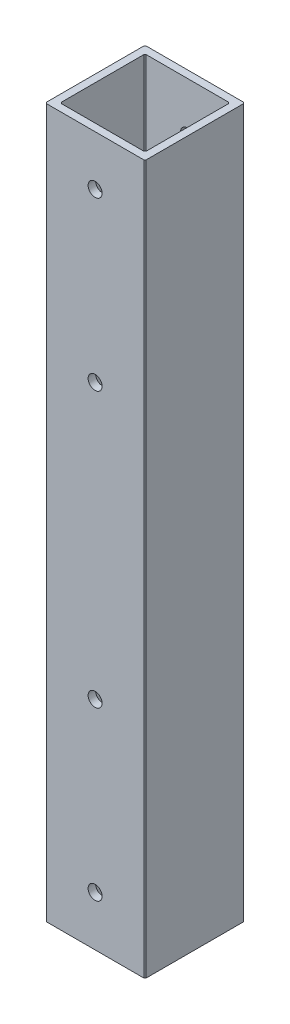
ISO-10303-21;
HEADER;
FILE_DESCRIPTION(('STEP AP214'),'2;1');
FILE_NAME('part.step','',(''),(''),'','','');
FILE_SCHEMA(('AUTOMOTIVE_DESIGN { 1 0 10303 214 1 1 1 1 }'));
ENDSEC;
DATA;
#1=APPLICATION_CONTEXT('core data for automotive mechanical design processes');
#2=APPLICATION_PROTOCOL_DEFINITION('international standard','automotive_design',2000,#1);
#3=PRODUCT_CONTEXT('',#1,'mechanical');
#4=PRODUCT('Part','Part','',(#3));
#5=PRODUCT_RELATED_PRODUCT_CATEGORY('part','',(#4));
#6=PRODUCT_DEFINITION_FORMATION('','',#4);
#7=PRODUCT_DEFINITION_CONTEXT('part definition',#1,'design');
#8=PRODUCT_DEFINITION('design','',#6,#7);
#9=PRODUCT_DEFINITION_SHAPE('','',#8);
#10=(LENGTH_UNIT() NAMED_UNIT(*) SI_UNIT(.MILLI.,.METRE.));
#11=(NAMED_UNIT(*) PLANE_ANGLE_UNIT() SI_UNIT($,.RADIAN.));
#12=(NAMED_UNIT(*) SI_UNIT($,.STERADIAN.) SOLID_ANGLE_UNIT());
#13=UNCERTAINTY_MEASURE_WITH_UNIT(LENGTH_MEASURE(1.E-05),#10,'distance_accuracy_value','');
#14=(GEOMETRIC_REPRESENTATION_CONTEXT(3) GLOBAL_UNCERTAINTY_ASSIGNED_CONTEXT((#13)) GLOBAL_UNIT_ASSIGNED_CONTEXT((#10,
#11,#12)) REPRESENTATION_CONTEXT('',''));
#15=CARTESIAN_POINT('',(0.,0.,0.));
#16=DIRECTION('',(0.,0.,1.));
#17=DIRECTION('',(1.,0.,0.));
#18=AXIS2_PLACEMENT_3D('',#15,#16,#17);
#19=CARTESIAN_POINT('',(-120.,142.,140.));
#20=DIRECTION('',(-1.,0.,0.));
#21=DIRECTION('',(0.,-1.,0.));
#22=AXIS2_PLACEMENT_3D('',#19,#20,#21);
#23=PLANE('',#22);
#24=DIRECTION('',(0.,0.,1.));
#25=VECTOR('',#24,1.);
#26=CARTESIAN_POINT('',(-120.,142.,140.));
#27=LINE('',#26,#25);
#28=CARTESIAN_POINT('',(-120.,142.,140.5));
#29=VERTEX_POINT('',#28);
#30=CARTESIAN_POINT('',(-120.,142.,179.5));
#31=VERTEX_POINT('',#30);
#32=EDGE_CURVE('E195',#29,#31,#27,.T.);
#33=ORIENTED_EDGE('',*,*,#32,.F.);
#34=DIRECTION('',(0.,-1.,0.));
#35=VECTOR('',#34,1.);
#36=CARTESIAN_POINT('',(-120.,-142.,140.5));
#37=LINE('',#36,#35);
#38=CARTESIAN_POINT('',(-120.,-142.,140.5));
#39=VERTEX_POINT('',#38);
#40=EDGE_CURVE('E221',#29,#39,#37,.T.);
#41=ORIENTED_EDGE('',*,*,#40,.T.);
#42=DIRECTION('',(0.,0.,1.));
#43=VECTOR('',#42,1.);
#44=CARTESIAN_POINT('',(-120.,-142.,140.));
#45=LINE('',#44,#43);
#46=CARTESIAN_POINT('',(-120.,-142.,179.5));
#47=VERTEX_POINT('',#46);
#48=EDGE_CURVE('E184',#39,#47,#45,.T.);
#49=ORIENTED_EDGE('',*,*,#48,.T.);
#50=DIRECTION('',(0.,1.,0.));
#51=VECTOR('',#50,1.);
#52=CARTESIAN_POINT('',(-120.,142.,179.5));
#53=LINE('',#52,#51);
#54=EDGE_CURVE('E172',#47,#31,#53,.T.);
#55=ORIENTED_EDGE('',*,*,#54,.T.);
#56=EDGE_LOOP('',(#33,#41,#49,#55));
#57=FACE_BOUND('',#56,.T.);
#58=ADVANCED_FACE('F45',(#57),#23,.T.);
#59=CARTESIAN_POINT('',(-79.9999999999999,142.,140.));
#60=DIRECTION('',(0.,1.,0.));
#61=DIRECTION('',(0.,0.,1.));
#62=AXIS2_PLACEMENT_3D('',#59,#60,#61);
#63=PLANE('',#62);
#64=DIRECTION('',(0.,0.,-1.));
#65=VECTOR('',#64,1.);
#66=CARTESIAN_POINT('',(-117.,142.,177.));
#67=LINE('',#66,#65);
#68=CARTESIAN_POINT('',(-117.,142.,176.5));
#69=VERTEX_POINT('',#68);
#70=CARTESIAN_POINT('',(-117.,142.,143.5));
#71=VERTEX_POINT('',#70);
#72=EDGE_CURVE('E304',#69,#71,#67,.T.);
#73=ORIENTED_EDGE('',*,*,#72,.T.);
#74=DIRECTION('',(-0.707106781186548,0.,0.707106781186548));
#75=VECTOR('',#74,1.);
#76=CARTESIAN_POINT('',(-116.5,142.,143.));
#77=LINE('',#76,#75);
#78=CARTESIAN_POINT('',(-116.5,142.,143.));
#79=VERTEX_POINT('',#78);
#80=EDGE_CURVE('E11',#71,#79,#77,.F.);
#81=ORIENTED_EDGE('',*,*,#80,.T.);
#82=DIRECTION('',(1.,0.,0.));
#83=VECTOR('',#82,1.);
#84=CARTESIAN_POINT('',(-117.,142.,143.));
#85=LINE('',#84,#83);
#86=CARTESIAN_POINT('',(-83.5,142.,143.));
#87=VERTEX_POINT('',#86);
#88=EDGE_CURVE('E294',#79,#87,#85,.T.);
#89=ORIENTED_EDGE('',*,*,#88,.T.);
#90=DIRECTION('',(-0.707106781186548,0.,-0.707106781186548));
#91=VECTOR('',#90,1.);
#92=CARTESIAN_POINT('',(-83.,142.,143.5));
#93=LINE('',#92,#91);
#94=CARTESIAN_POINT('',(-83.,142.,143.5));
#95=VERTEX_POINT('',#94);
#96=EDGE_CURVE('E269',#87,#95,#93,.F.);
#97=ORIENTED_EDGE('',*,*,#96,.T.);
#98=DIRECTION('',(0.,0.,1.));
#99=VECTOR('',#98,1.);
#100=CARTESIAN_POINT('',(-83.,142.,143.));
#101=LINE('',#100,#99);
#102=CARTESIAN_POINT('',(-83.,142.,176.5));
#103=VERTEX_POINT('',#102);
#104=EDGE_CURVE('E309',#95,#103,#101,.T.);
#105=ORIENTED_EDGE('',*,*,#104,.T.);
#106=DIRECTION('',(0.707106781186548,0.,-0.707106781186548));
#107=VECTOR('',#106,1.);
#108=CARTESIAN_POINT('',(-83.4999999999999,142.,177.));
#109=LINE('',#108,#107);
#110=CARTESIAN_POINT('',(-83.4999999999999,142.,177.));
#111=VERTEX_POINT('',#110);
#112=EDGE_CURVE('E275',#103,#111,#109,.F.);
#113=ORIENTED_EDGE('',*,*,#112,.T.);
#114=DIRECTION('',(-1.,0.,0.));
#115=VECTOR('',#114,1.);
#116=CARTESIAN_POINT('',(-83.,142.,177.));
#117=LINE('',#116,#115);
#118=CARTESIAN_POINT('',(-116.5,142.,177.));
#119=VERTEX_POINT('',#118);
#120=EDGE_CURVE('E313',#111,#119,#117,.T.);
#121=ORIENTED_EDGE('',*,*,#120,.T.);
#122=DIRECTION('',(0.707106781186548,0.,0.707106781186548));
#123=VECTOR('',#122,1.);
#124=CARTESIAN_POINT('',(-117.,142.,176.5));
#125=LINE('',#124,#123);
#126=EDGE_CURVE('E263',#119,#69,#125,.F.);
#127=ORIENTED_EDGE('',*,*,#126,.T.);
#128=EDGE_LOOP('',(#73,#81,#89,#97,#105,#113,#121,#127));
#129=FACE_BOUND('',#128,.T.);
#130=DIRECTION('',(0.,0.,1.));
#131=VECTOR('',#130,1.);
#132=CARTESIAN_POINT('',(-79.9999999999999,142.,140.));
#133=LINE('',#132,#131);
#134=CARTESIAN_POINT('',(-79.9999999999999,142.,140.5));
#135=VERTEX_POINT('',#134);
#136=CARTESIAN_POINT('',(-79.9999999999999,142.,179.5));
#137=VERTEX_POINT('',#136);
#138=EDGE_CURVE('E183',#135,#137,#133,.T.);
#139=ORIENTED_EDGE('',*,*,#138,.F.);
#140=DIRECTION('',(-0.707106781186543,0.,-0.707106781186553));
#141=VECTOR('',#140,1.);
#142=CARTESIAN_POINT('',(-80.2499999999999,142.,140.25));
#143=LINE('',#142,#141);
#144=CARTESIAN_POINT('',(-80.4999999999999,142.,140.));
#145=VERTEX_POINT('',#144);
#146=EDGE_CURVE('E187',#135,#145,#143,.T.);
#147=ORIENTED_EDGE('',*,*,#146,.T.);
#148=DIRECTION('',(-1.,0.,0.));
#149=VECTOR('',#148,1.);
#150=CARTESIAN_POINT('',(-79.9999999999999,142.,140.));
#151=LINE('',#150,#149);
#152=CARTESIAN_POINT('',(-119.5,142.,140.));
#153=VERTEX_POINT('',#152);
#154=EDGE_CURVE('E336',#145,#153,#151,.T.);
#155=ORIENTED_EDGE('',*,*,#154,.T.);
#156=DIRECTION('',(-0.707106781186543,0.,0.707106781186553));
#157=VECTOR('',#156,1.);
#158=CARTESIAN_POINT('',(-99.7500000000002,142.,120.25));
#159=LINE('',#158,#157);
#160=EDGE_CURVE('E201',#153,#29,#159,.T.);
#161=ORIENTED_EDGE('',*,*,#160,.T.);
#162=ORIENTED_EDGE('',*,*,#32,.T.);
#163=DIRECTION('',(-0.707106781186543,0.,-0.707106781186552));
#164=VECTOR('',#163,1.);
#165=CARTESIAN_POINT('',(-119.75,142.,179.75));
#166=LINE('',#165,#164);
#167=CARTESIAN_POINT('',(-119.5,142.,180.));
#168=VERTEX_POINT('',#167);
#169=EDGE_CURVE('E193',#31,#168,#166,.F.);
#170=ORIENTED_EDGE('',*,*,#169,.T.);
#171=DIRECTION('',(-1.,0.,0.));
#172=VECTOR('',#171,1.);
#173=CARTESIAN_POINT('',(-79.9999999999999,142.,180.));
#174=LINE('',#173,#172);
#175=CARTESIAN_POINT('',(-80.4999999999998,142.,180.));
#176=VERTEX_POINT('',#175);
#177=EDGE_CURVE('E337',#176,#168,#174,.T.);
#178=ORIENTED_EDGE('',*,*,#177,.F.);
#179=DIRECTION('',(-0.707106781186543,0.,0.707106781186552));
#180=VECTOR('',#179,1.);
#181=CARTESIAN_POINT('',(-60.2499999999999,142.,159.75));
#182=LINE('',#181,#180);
#183=EDGE_CURVE('E189',#176,#137,#182,.F.);
#184=ORIENTED_EDGE('',*,*,#183,.T.);
#185=EDGE_LOOP('',(#139,#147,#155,#161,#162,#170,#178,#184));
#186=FACE_BOUND('',#185,.T.);
#187=ADVANCED_FACE('F301',(#129,#186),#63,.T.);
#188=CARTESIAN_POINT('',(-80.,-142.,140.));
#189=DIRECTION('',(1.,0.,0.));
#190=DIRECTION('',(0.,1.,0.));
#191=AXIS2_PLACEMENT_3D('',#188,#189,#190);
#192=PLANE('',#191);
#193=DIRECTION('',(0.,0.,1.));
#194=VECTOR('',#193,1.);
#195=CARTESIAN_POINT('',(-80.,-142.,140.));
#196=LINE('',#195,#194);
#197=CARTESIAN_POINT('',(-80.,-142.,140.5));
#198=VERTEX_POINT('',#197);
#199=CARTESIAN_POINT('',(-80.,-142.,179.5));
#200=VERTEX_POINT('',#199);
#201=EDGE_CURVE('E164',#198,#200,#196,.T.);
#202=ORIENTED_EDGE('',*,*,#201,.F.);
#203=DIRECTION('',(0.,1.,0.));
#204=VECTOR('',#203,1.);
#205=CARTESIAN_POINT('',(-79.9999999999999,142.,140.5));
#206=LINE('',#205,#204);
#207=EDGE_CURVE('E178',#198,#135,#206,.T.);
#208=ORIENTED_EDGE('',*,*,#207,.T.);
#209=ORIENTED_EDGE('',*,*,#138,.T.);
#210=DIRECTION('',(0.,-1.,0.));
#211=VECTOR('',#210,1.);
#212=CARTESIAN_POINT('',(-80.,-142.,179.5));
#213=LINE('',#212,#211);
#214=EDGE_CURVE('E181',#137,#200,#213,.T.);
#215=ORIENTED_EDGE('',*,*,#214,.T.);
#216=EDGE_LOOP('',(#202,#208,#209,#215));
#217=FACE_BOUND('',#216,.T.);
#218=ADVANCED_FACE('F176',(#217),#192,.T.);
#219=CARTESIAN_POINT('',(-120.,-142.,140.));
#220=DIRECTION('',(0.,-1.,0.));
#221=DIRECTION('',(0.,0.,-1.));
#222=AXIS2_PLACEMENT_3D('',#219,#220,#221);
#223=PLANE('',#222);
#224=DIRECTION('',(1.,0.,0.));
#225=VECTOR('',#224,1.);
#226=CARTESIAN_POINT('',(-117.,-142.,143.));
#227=LINE('',#226,#225);
#228=CARTESIAN_POINT('',(-116.5,-142.,143.));
#229=VERTEX_POINT('',#228);
#230=CARTESIAN_POINT('',(-83.5,-142.,143.));
#231=VERTEX_POINT('',#230);
#232=EDGE_CURVE('E284',#229,#231,#227,.T.);
#233=ORIENTED_EDGE('',*,*,#232,.F.);
#234=DIRECTION('',(0.707106781186548,0.,-0.707106781186548));
#235=VECTOR('',#234,1.);
#236=CARTESIAN_POINT('',(-116.5,-142.,143.));
#237=LINE('',#236,#235);
#238=CARTESIAN_POINT('',(-117.,-142.,143.5));
#239=VERTEX_POINT('',#238);
#240=EDGE_CURVE('E55',#229,#239,#237,.F.);
#241=ORIENTED_EDGE('',*,*,#240,.T.);
#242=DIRECTION('',(0.,0.,-1.));
#243=VECTOR('',#242,1.);
#244=CARTESIAN_POINT('',(-117.,-142.,177.));
#245=LINE('',#244,#243);
#246=CARTESIAN_POINT('',(-117.,-142.,176.5));
#247=VERTEX_POINT('',#246);
#248=EDGE_CURVE('E282',#247,#239,#245,.T.);
#249=ORIENTED_EDGE('',*,*,#248,.F.);
#250=DIRECTION('',(-0.707106781186548,0.,-0.707106781186548));
#251=VECTOR('',#250,1.);
#252=CARTESIAN_POINT('',(-117.,-142.,176.5));
#253=LINE('',#252,#251);
#254=CARTESIAN_POINT('',(-116.5,-142.,177.));
#255=VERTEX_POINT('',#254);
#256=EDGE_CURVE('E260',#247,#255,#253,.F.);
#257=ORIENTED_EDGE('',*,*,#256,.T.);
#258=DIRECTION('',(-1.,0.,0.));
#259=VECTOR('',#258,1.);
#260=CARTESIAN_POINT('',(-83.,-142.,177.));
#261=LINE('',#260,#259);
#262=CARTESIAN_POINT('',(-83.4999999999999,-142.,177.));
#263=VERTEX_POINT('',#262);
#264=EDGE_CURVE('E295',#263,#255,#261,.T.);
#265=ORIENTED_EDGE('',*,*,#264,.F.);
#266=DIRECTION('',(-0.707106781186548,0.,0.707106781186548));
#267=VECTOR('',#266,1.);
#268=CARTESIAN_POINT('',(-83.4999999999999,-142.,177.));
#269=LINE('',#268,#267);
#270=CARTESIAN_POINT('',(-83.,-142.,176.5));
#271=VERTEX_POINT('',#270);
#272=EDGE_CURVE('E272',#263,#271,#269,.F.);
#273=ORIENTED_EDGE('',*,*,#272,.T.);
#274=DIRECTION('',(0.,0.,1.));
#275=VECTOR('',#274,1.);
#276=CARTESIAN_POINT('',(-83.,-142.,143.));
#277=LINE('',#276,#275);
#278=CARTESIAN_POINT('',(-83.,-142.,143.5));
#279=VERTEX_POINT('',#278);
#280=EDGE_CURVE('E327',#279,#271,#277,.T.);
#281=ORIENTED_EDGE('',*,*,#280,.F.);
#282=DIRECTION('',(0.707106781186548,0.,0.707106781186548));
#283=VECTOR('',#282,1.);
#284=CARTESIAN_POINT('',(-83.,-142.,143.5));
#285=LINE('',#284,#283);
#286=EDGE_CURVE('E266',#279,#231,#285,.F.);
#287=ORIENTED_EDGE('',*,*,#286,.T.);
#288=EDGE_LOOP('',(#233,#241,#249,#257,#265,#273,#281,#287));
#289=FACE_BOUND('',#288,.T.);
#290=DIRECTION('',(1.,0.,0.));
#291=VECTOR('',#290,1.);
#292=CARTESIAN_POINT('',(-120.,-142.,140.));
#293=LINE('',#292,#291);
#294=CARTESIAN_POINT('',(-119.5,-142.,140.));
#295=VERTEX_POINT('',#294);
#296=CARTESIAN_POINT('',(-80.5,-142.,140.));
#297=VERTEX_POINT('',#296);
#298=EDGE_CURVE('E167',#295,#297,#293,.T.);
#299=ORIENTED_EDGE('',*,*,#298,.T.);
#300=DIRECTION('',(0.707106781186543,0.,0.707106781186553));
#301=VECTOR('',#300,1.);
#302=CARTESIAN_POINT('',(-100.25,-142.,120.25));
#303=LINE('',#302,#301);
#304=EDGE_CURVE('E161',#297,#198,#303,.T.);
#305=ORIENTED_EDGE('',*,*,#304,.T.);
#306=ORIENTED_EDGE('',*,*,#201,.T.);
#307=DIRECTION('',(0.707106781186543,0.,-0.707106781186552));
#308=VECTOR('',#307,1.);
#309=CARTESIAN_POINT('',(-80.2499999999997,-142.,179.75));
#310=LINE('',#309,#308);
#311=CARTESIAN_POINT('',(-80.4999999999999,-142.,180.));
#312=VERTEX_POINT('',#311);
#313=EDGE_CURVE('E212',#200,#312,#310,.F.);
#314=ORIENTED_EDGE('',*,*,#313,.T.);
#315=DIRECTION('',(1.,0.,0.));
#316=VECTOR('',#315,1.);
#317=CARTESIAN_POINT('',(-120.,-142.,180.));
#318=LINE('',#317,#316);
#319=CARTESIAN_POINT('',(-119.5,-142.,180.));
#320=VERTEX_POINT('',#319);
#321=EDGE_CURVE('E324',#320,#312,#318,.T.);
#322=ORIENTED_EDGE('',*,*,#321,.F.);
#323=DIRECTION('',(0.707106781186543,0.,0.707106781186552));
#324=VECTOR('',#323,1.);
#325=CARTESIAN_POINT('',(-139.75,-142.,159.75));
#326=LINE('',#325,#324);
#327=EDGE_CURVE('E62',#320,#47,#326,.F.);
#328=ORIENTED_EDGE('',*,*,#327,.T.);
#329=ORIENTED_EDGE('',*,*,#48,.F.);
#330=DIRECTION('',(0.707106781186543,0.,-0.707106781186553));
#331=VECTOR('',#330,1.);
#332=CARTESIAN_POINT('',(-119.75,-142.,140.25));
#333=LINE('',#332,#331);
#334=EDGE_CURVE('E70',#39,#295,#333,.T.);
#335=ORIENTED_EDGE('',*,*,#334,.T.);
#336=EDGE_LOOP('',(#299,#305,#306,#314,#322,#328,#329,#335));
#337=FACE_BOUND('',#336,.T.);
#338=ADVANCED_FACE('F163',(#289,#337),#223,.T.);
#339=CARTESIAN_POINT('',(0.,0.,140.));
#340=DIRECTION('',(0.,0.,1.));
#341=DIRECTION('',(1.,0.,0.));
#342=AXIS2_PLACEMENT_3D('',#339,#340,#341);
#343=PLANE('',#342);
#344=CARTESIAN_POINT('',(-100.,122.,140.));
#345=DIRECTION('',(0.,0.,-1.));
#346=DIRECTION('',(-1.,0.,0.));
#347=AXIS2_PLACEMENT_3D('',#344,#345,#346);
#348=CIRCLE('',#347,2.79999999999998);
#349=CARTESIAN_POINT('',(-102.8,122.,140.));
#350=VERTEX_POINT('',#349);
#351=EDGE_CURVE('E726',#350,#350,#348,.T.);
#352=ORIENTED_EDGE('',*,*,#351,.F.);
#353=EDGE_LOOP('',(#352));
#354=FACE_BOUND('',#353,.T.);
#355=CARTESIAN_POINT('',(-100.,55.,140.));
#356=DIRECTION('',(0.,0.,-1.));
#357=DIRECTION('',(-1.,0.,0.));
#358=AXIS2_PLACEMENT_3D('',#355,#356,#357);
#359=CIRCLE('',#358,2.79999999999998);
#360=CARTESIAN_POINT('',(-102.8,55.,140.));
#361=VERTEX_POINT('',#360);
#362=EDGE_CURVE('E707',#361,#361,#359,.T.);
#363=ORIENTED_EDGE('',*,*,#362,.F.);
#364=EDGE_LOOP('',(#363));
#365=FACE_BOUND('',#364,.T.);
#366=CARTESIAN_POINT('',(-100.,-55.,140.));
#367=DIRECTION('',(0.,0.,-1.));
#368=DIRECTION('',(-1.,0.,0.));
#369=AXIS2_PLACEMENT_3D('',#366,#367,#368);
#370=CIRCLE('',#369,2.79999999999998);
#371=CARTESIAN_POINT('',(-102.8,-55.,140.));
#372=VERTEX_POINT('',#371);
#373=EDGE_CURVE('E697',#372,#372,#370,.T.);
#374=ORIENTED_EDGE('',*,*,#373,.F.);
#375=EDGE_LOOP('',(#374));
#376=FACE_BOUND('',#375,.T.);
#377=CARTESIAN_POINT('',(-100.,-122.,140.));
#378=DIRECTION('',(0.,0.,-1.));
#379=DIRECTION('',(-1.,0.,0.));
#380=AXIS2_PLACEMENT_3D('',#377,#378,#379);
#381=CIRCLE('',#380,2.79999999999998);
#382=CARTESIAN_POINT('',(-102.8,-122.,140.));
#383=VERTEX_POINT('',#382);
#384=EDGE_CURVE('E704',#383,#383,#381,.T.);
#385=ORIENTED_EDGE('',*,*,#384,.F.);
#386=EDGE_LOOP('',(#385));
#387=FACE_BOUND('',#386,.T.);
#388=ORIENTED_EDGE('',*,*,#154,.F.);
#389=DIRECTION('',(0.,-1.,0.));
#390=VECTOR('',#389,1.);
#391=CARTESIAN_POINT('',(-80.5,-142.,140.));
#392=LINE('',#391,#390);
#393=EDGE_CURVE('E209',#145,#297,#392,.T.);
#394=ORIENTED_EDGE('',*,*,#393,.T.);
#395=ORIENTED_EDGE('',*,*,#298,.F.);
#396=DIRECTION('',(0.,1.,0.));
#397=VECTOR('',#396,1.);
#398=CARTESIAN_POINT('',(-119.5,142.,140.));
#399=LINE('',#398,#397);
#400=EDGE_CURVE('E206',#295,#153,#399,.T.);
#401=ORIENTED_EDGE('',*,*,#400,.T.);
#402=EDGE_LOOP('',(#388,#394,#395,#401));
#403=FACE_BOUND('',#402,.T.);
#404=ADVANCED_FACE('F368',(#354,#365,#376,#387,#403),#343,.F.);
#405=CARTESIAN_POINT('',(0.,0.,180.));
#406=DIRECTION('',(0.,0.,1.));
#407=DIRECTION('',(1.,0.,0.));
#408=AXIS2_PLACEMENT_3D('',#405,#406,#407);
#409=PLANE('',#408);
#410=CARTESIAN_POINT('',(-100.,122.,180.));
#411=DIRECTION('',(0.,0.,-1.));
#412=DIRECTION('',(-1.,0.,0.));
#413=AXIS2_PLACEMENT_3D('',#410,#411,#412);
#414=CIRCLE('',#413,2.79999999999998);
#415=CARTESIAN_POINT('',(-102.8,122.,180.));
#416=VERTEX_POINT('',#415);
#417=EDGE_CURVE('E754',#416,#416,#414,.T.);
#418=ORIENTED_EDGE('',*,*,#417,.T.);
#419=EDGE_LOOP('',(#418));
#420=FACE_BOUND('',#419,.T.);
#421=CARTESIAN_POINT('',(-100.,55.,180.));
#422=DIRECTION('',(0.,0.,-1.));
#423=DIRECTION('',(-1.,0.,0.));
#424=AXIS2_PLACEMENT_3D('',#421,#422,#423);
#425=CIRCLE('',#424,2.79999999999998);
#426=CARTESIAN_POINT('',(-102.8,55.,180.));
#427=VERTEX_POINT('',#426);
#428=EDGE_CURVE('E746',#427,#427,#425,.T.);
#429=ORIENTED_EDGE('',*,*,#428,.T.);
#430=EDGE_LOOP('',(#429));
#431=FACE_BOUND('',#430,.T.);
#432=CARTESIAN_POINT('',(-100.,-55.,180.));
#433=DIRECTION('',(0.,0.,-1.));
#434=DIRECTION('',(-1.,0.,0.));
#435=AXIS2_PLACEMENT_3D('',#432,#433,#434);
#436=CIRCLE('',#435,2.79999999999998);
#437=CARTESIAN_POINT('',(-102.8,-55.,180.));
#438=VERTEX_POINT('',#437);
#439=EDGE_CURVE('E738',#438,#438,#436,.T.);
#440=ORIENTED_EDGE('',*,*,#439,.T.);
#441=EDGE_LOOP('',(#440));
#442=FACE_BOUND('',#441,.T.);
#443=CARTESIAN_POINT('',(-100.,-122.,180.));
#444=DIRECTION('',(0.,0.,-1.));
#445=DIRECTION('',(-1.,0.,0.));
#446=AXIS2_PLACEMENT_3D('',#443,#444,#445);
#447=CIRCLE('',#446,2.79999999999998);
#448=CARTESIAN_POINT('',(-102.8,-122.,180.));
#449=VERTEX_POINT('',#448);
#450=EDGE_CURVE('E730',#449,#449,#447,.T.);
#451=ORIENTED_EDGE('',*,*,#450,.T.);
#452=EDGE_LOOP('',(#451));
#453=FACE_BOUND('',#452,.T.);
#454=ORIENTED_EDGE('',*,*,#177,.T.);
#455=DIRECTION('',(0.,-1.,0.));
#456=VECTOR('',#455,1.);
#457=CARTESIAN_POINT('',(-119.5,0.,180.));
#458=LINE('',#457,#456);
#459=EDGE_CURVE('E228',#168,#320,#458,.T.);
#460=ORIENTED_EDGE('',*,*,#459,.T.);
#461=ORIENTED_EDGE('',*,*,#321,.T.);
#462=DIRECTION('',(0.,1.,0.));
#463=VECTOR('',#462,1.);
#464=CARTESIAN_POINT('',(-80.4999999999999,0.,180.));
#465=LINE('',#464,#463);
#466=EDGE_CURVE('E224',#312,#176,#465,.T.);
#467=ORIENTED_EDGE('',*,*,#466,.T.);
#468=EDGE_LOOP('',(#454,#460,#461,#467));
#469=FACE_BOUND('',#468,.T.);
#470=ADVANCED_FACE('F361',(#420,#431,#442,#453,#469),#409,.T.);
#471=CARTESIAN_POINT('',(-117.,142.,143.));
#472=DIRECTION('',(0.,0.,-1.));
#473=DIRECTION('',(-1.,0.,0.));
#474=AXIS2_PLACEMENT_3D('',#471,#472,#473);
#475=PLANE('',#474);
#476=CARTESIAN_POINT('',(-100.,122.,143.));
#477=DIRECTION('',(0.,0.,-1.));
#478=DIRECTION('',(-1.,0.,0.));
#479=AXIS2_PLACEMENT_3D('',#476,#477,#478);
#480=CIRCLE('',#479,2.79999999999999);
#481=CARTESIAN_POINT('',(-102.8,122.,143.));
#482=VERTEX_POINT('',#481);
#483=EDGE_CURVE('E722',#482,#482,#480,.T.);
#484=ORIENTED_EDGE('',*,*,#483,.T.);
#485=EDGE_LOOP('',(#484));
#486=FACE_BOUND('',#485,.T.);
#487=CARTESIAN_POINT('',(-100.,55.,143.));
#488=DIRECTION('',(0.,0.,-1.));
#489=DIRECTION('',(-1.,0.,0.));
#490=AXIS2_PLACEMENT_3D('',#487,#488,#489);
#491=CIRCLE('',#490,2.79999999999999);
#492=CARTESIAN_POINT('',(-102.8,55.,143.));
#493=VERTEX_POINT('',#492);
#494=EDGE_CURVE('E700',#493,#493,#491,.T.);
#495=ORIENTED_EDGE('',*,*,#494,.T.);
#496=EDGE_LOOP('',(#495));
#497=FACE_BOUND('',#496,.T.);
#498=CARTESIAN_POINT('',(-100.,-55.,143.));
#499=DIRECTION('',(0.,0.,-1.));
#500=DIRECTION('',(-1.,0.,0.));
#501=AXIS2_PLACEMENT_3D('',#498,#499,#500);
#502=CIRCLE('',#501,2.79999999999999);
#503=CARTESIAN_POINT('',(-102.8,-55.,143.));
#504=VERTEX_POINT('',#503);
#505=EDGE_CURVE('E694',#504,#504,#502,.T.);
#506=ORIENTED_EDGE('',*,*,#505,.T.);
#507=EDGE_LOOP('',(#506));
#508=FACE_BOUND('',#507,.T.);
#509=CARTESIAN_POINT('',(-100.,-122.,143.));
#510=DIRECTION('',(0.,0.,-1.));
#511=DIRECTION('',(-1.,0.,0.));
#512=AXIS2_PLACEMENT_3D('',#509,#510,#511);
#513=CIRCLE('',#512,2.79999999999999);
#514=CARTESIAN_POINT('',(-102.8,-122.,143.));
#515=VERTEX_POINT('',#514);
#516=EDGE_CURVE('E316',#515,#515,#513,.T.);
#517=ORIENTED_EDGE('',*,*,#516,.T.);
#518=EDGE_LOOP('',(#517));
#519=FACE_BOUND('',#518,.T.);
#520=ORIENTED_EDGE('',*,*,#232,.T.);
#521=DIRECTION('',(0.,1.,0.));
#522=VECTOR('',#521,1.);
#523=CARTESIAN_POINT('',(-83.5,142.,143.));
#524=LINE('',#523,#522);
#525=EDGE_CURVE('E257',#231,#87,#524,.T.);
#526=ORIENTED_EDGE('',*,*,#525,.T.);
#527=ORIENTED_EDGE('',*,*,#88,.F.);
#528=DIRECTION('',(0.,-1.,0.));
#529=VECTOR('',#528,1.);
#530=CARTESIAN_POINT('',(-116.5,-142.,143.));
#531=LINE('',#530,#529);
#532=EDGE_CURVE('E253',#79,#229,#531,.T.);
#533=ORIENTED_EDGE('',*,*,#532,.T.);
#534=EDGE_LOOP('',(#520,#526,#527,#533));
#535=FACE_BOUND('',#534,.T.);
#536=ADVANCED_FACE('F306',(#486,#497,#508,#519,#535),#475,.F.);
#537=CARTESIAN_POINT('',(-117.,142.,177.));
#538=DIRECTION('',(-1.,0.,0.));
#539=DIRECTION('',(0.,0.,1.));
#540=AXIS2_PLACEMENT_3D('',#537,#538,#539);
#541=PLANE('',#540);
#542=ORIENTED_EDGE('',*,*,#72,.F.);
#543=DIRECTION('',(0.,-1.,0.));
#544=VECTOR('',#543,1.);
#545=CARTESIAN_POINT('',(-117.,-142.,176.5));
#546=LINE('',#545,#544);
#547=EDGE_CURVE('E235',#69,#247,#546,.T.);
#548=ORIENTED_EDGE('',*,*,#547,.T.);
#549=ORIENTED_EDGE('',*,*,#248,.T.);
#550=DIRECTION('',(0.,1.,0.));
#551=VECTOR('',#550,1.);
#552=CARTESIAN_POINT('',(-117.,142.,143.5));
#553=LINE('',#552,#551);
#554=EDGE_CURVE('E232',#239,#71,#553,.T.);
#555=ORIENTED_EDGE('',*,*,#554,.T.);
#556=EDGE_LOOP('',(#542,#548,#549,#555));
#557=FACE_BOUND('',#556,.T.);
#558=ADVANCED_FACE('F290',(#557),#541,.F.);
#559=CARTESIAN_POINT('',(-83.,142.,177.));
#560=DIRECTION('',(0.,0.,1.));
#561=DIRECTION('',(1.,0.,0.));
#562=AXIS2_PLACEMENT_3D('',#559,#560,#561);
#563=PLANE('',#562);
#564=CARTESIAN_POINT('',(-100.,122.,177.));
#565=DIRECTION('',(0.,0.,-1.));
#566=DIRECTION('',(-1.,0.,0.));
#567=AXIS2_PLACEMENT_3D('',#564,#565,#566);
#568=CIRCLE('',#567,2.79999999999998);
#569=CARTESIAN_POINT('',(-102.8,122.,177.));
#570=VERTEX_POINT('',#569);
#571=EDGE_CURVE('E758',#570,#570,#568,.T.);
#572=ORIENTED_EDGE('',*,*,#571,.F.);
#573=EDGE_LOOP('',(#572));
#574=FACE_BOUND('',#573,.T.);
#575=CARTESIAN_POINT('',(-100.,55.,177.));
#576=DIRECTION('',(0.,0.,-1.));
#577=DIRECTION('',(-1.,0.,0.));
#578=AXIS2_PLACEMENT_3D('',#575,#576,#577);
#579=CIRCLE('',#578,2.79999999999998);
#580=CARTESIAN_POINT('',(-102.8,55.,177.));
#581=VERTEX_POINT('',#580);
#582=EDGE_CURVE('E750',#581,#581,#579,.T.);
#583=ORIENTED_EDGE('',*,*,#582,.F.);
#584=EDGE_LOOP('',(#583));
#585=FACE_BOUND('',#584,.T.);
#586=CARTESIAN_POINT('',(-100.,-55.,177.));
#587=DIRECTION('',(0.,0.,-1.));
#588=DIRECTION('',(-1.,0.,0.));
#589=AXIS2_PLACEMENT_3D('',#586,#587,#588);
#590=CIRCLE('',#589,2.79999999999998);
#591=CARTESIAN_POINT('',(-102.8,-55.,177.));
#592=VERTEX_POINT('',#591);
#593=EDGE_CURVE('E742',#592,#592,#590,.T.);
#594=ORIENTED_EDGE('',*,*,#593,.F.);
#595=EDGE_LOOP('',(#594));
#596=FACE_BOUND('',#595,.T.);
#597=CARTESIAN_POINT('',(-100.,-122.,177.));
#598=DIRECTION('',(0.,0.,-1.));
#599=DIRECTION('',(-1.,0.,0.));
#600=AXIS2_PLACEMENT_3D('',#597,#598,#599);
#601=CIRCLE('',#600,2.79999999999998);
#602=CARTESIAN_POINT('',(-102.8,-122.,177.));
#603=VERTEX_POINT('',#602);
#604=EDGE_CURVE('E734',#603,#603,#601,.T.);
#605=ORIENTED_EDGE('',*,*,#604,.F.);
#606=EDGE_LOOP('',(#605));
#607=FACE_BOUND('',#606,.T.);
#608=ORIENTED_EDGE('',*,*,#264,.T.);
#609=DIRECTION('',(0.,1.,0.));
#610=VECTOR('',#609,1.);
#611=CARTESIAN_POINT('',(-116.5,142.,177.));
#612=LINE('',#611,#610);
#613=EDGE_CURVE('E243',#255,#119,#612,.T.);
#614=ORIENTED_EDGE('',*,*,#613,.T.);
#615=ORIENTED_EDGE('',*,*,#120,.F.);
#616=DIRECTION('',(0.,-1.,0.));
#617=VECTOR('',#616,1.);
#618=CARTESIAN_POINT('',(-83.4999999999999,-142.,177.));
#619=LINE('',#618,#617);
#620=EDGE_CURVE('E239',#111,#263,#619,.T.);
#621=ORIENTED_EDGE('',*,*,#620,.T.);
#622=EDGE_LOOP('',(#608,#614,#615,#621));
#623=FACE_BOUND('',#622,.T.);
#624=ADVANCED_FACE('F430',(#574,#585,#596,#607,#623),#563,.F.);
#625=CARTESIAN_POINT('',(-83.,142.,143.));
#626=DIRECTION('',(1.,0.,0.));
#627=DIRECTION('',(0.,0.,-1.));
#628=AXIS2_PLACEMENT_3D('',#625,#626,#627);
#629=PLANE('',#628);
#630=ORIENTED_EDGE('',*,*,#104,.F.);
#631=DIRECTION('',(0.,-1.,0.));
#632=VECTOR('',#631,1.);
#633=CARTESIAN_POINT('',(-83.,-142.,143.5));
#634=LINE('',#633,#632);
#635=EDGE_CURVE('E249',#95,#279,#634,.T.);
#636=ORIENTED_EDGE('',*,*,#635,.T.);
#637=ORIENTED_EDGE('',*,*,#280,.T.);
#638=DIRECTION('',(0.,1.,0.));
#639=VECTOR('',#638,1.);
#640=CARTESIAN_POINT('',(-83.,142.,176.5));
#641=LINE('',#640,#639);
#642=EDGE_CURVE('E246',#271,#103,#641,.T.);
#643=ORIENTED_EDGE('',*,*,#642,.T.);
#644=EDGE_LOOP('',(#630,#636,#637,#643));
#645=FACE_BOUND('',#644,.T.);
#646=ADVANCED_FACE('F436',(#645),#629,.F.);
#647=CARTESIAN_POINT('',(-100.,-122.,140.));
#648=DIRECTION('',(0.,0.,-1.));
#649=DIRECTION('',(-1.,0.,0.));
#650=AXIS2_PLACEMENT_3D('',#647,#648,#649);
#651=CYLINDRICAL_SURFACE('',#650,2.79999999999999);
#652=ORIENTED_EDGE('',*,*,#516,.F.);
#653=EDGE_LOOP('',(#652));
#654=FACE_BOUND('',#653,.T.);
#655=ORIENTED_EDGE('',*,*,#384,.T.);
#656=EDGE_LOOP('',(#655));
#657=FACE_BOUND('',#656,.T.);
#658=ADVANCED_FACE('F439',(#654,#657),#651,.F.);
#659=CARTESIAN_POINT('',(-100.,-55.,140.));
#660=DIRECTION('',(0.,0.,-1.));
#661=DIRECTION('',(-1.,0.,0.));
#662=AXIS2_PLACEMENT_3D('',#659,#660,#661);
#663=CYLINDRICAL_SURFACE('',#662,2.79999999999999);
#664=ORIENTED_EDGE('',*,*,#505,.F.);
#665=EDGE_LOOP('',(#664));
#666=FACE_BOUND('',#665,.T.);
#667=ORIENTED_EDGE('',*,*,#373,.T.);
#668=EDGE_LOOP('',(#667));
#669=FACE_BOUND('',#668,.T.);
#670=ADVANCED_FACE('F445',(#666,#669),#663,.F.);
#671=CARTESIAN_POINT('',(-100.,55.,140.));
#672=DIRECTION('',(0.,0.,-1.));
#673=DIRECTION('',(-1.,0.,0.));
#674=AXIS2_PLACEMENT_3D('',#671,#672,#673);
#675=CYLINDRICAL_SURFACE('',#674,2.79999999999999);
#676=ORIENTED_EDGE('',*,*,#494,.F.);
#677=EDGE_LOOP('',(#676));
#678=FACE_BOUND('',#677,.T.);
#679=ORIENTED_EDGE('',*,*,#362,.T.);
#680=EDGE_LOOP('',(#679));
#681=FACE_BOUND('',#680,.T.);
#682=ADVANCED_FACE('F605',(#678,#681),#675,.F.);
#683=CARTESIAN_POINT('',(-100.,122.,140.));
#684=DIRECTION('',(0.,0.,-1.));
#685=DIRECTION('',(-1.,0.,0.));
#686=AXIS2_PLACEMENT_3D('',#683,#684,#685);
#687=CYLINDRICAL_SURFACE('',#686,2.79999999999999);
#688=ORIENTED_EDGE('',*,*,#483,.F.);
#689=EDGE_LOOP('',(#688));
#690=FACE_BOUND('',#689,.T.);
#691=ORIENTED_EDGE('',*,*,#351,.T.);
#692=EDGE_LOOP('',(#691));
#693=FACE_BOUND('',#692,.T.);
#694=ADVANCED_FACE('F595',(#690,#693),#687,.F.);
#695=CARTESIAN_POINT('',(-100.,-122.,177.));
#696=DIRECTION('',(0.,0.,-1.));
#697=DIRECTION('',(-1.,0.,0.));
#698=AXIS2_PLACEMENT_3D('',#695,#696,#697);
#699=CYLINDRICAL_SURFACE('',#698,2.79999999999998);
#700=ORIENTED_EDGE('',*,*,#450,.F.);
#701=EDGE_LOOP('',(#700));
#702=FACE_BOUND('',#701,.T.);
#703=ORIENTED_EDGE('',*,*,#604,.T.);
#704=EDGE_LOOP('',(#703));
#705=FACE_BOUND('',#704,.T.);
#706=ADVANCED_FACE('F585',(#702,#705),#699,.F.);
#707=CARTESIAN_POINT('',(-100.,-55.,177.));
#708=DIRECTION('',(0.,0.,-1.));
#709=DIRECTION('',(-1.,0.,0.));
#710=AXIS2_PLACEMENT_3D('',#707,#708,#709);
#711=CYLINDRICAL_SURFACE('',#710,2.79999999999998);
#712=ORIENTED_EDGE('',*,*,#439,.F.);
#713=EDGE_LOOP('',(#712));
#714=FACE_BOUND('',#713,.T.);
#715=ORIENTED_EDGE('',*,*,#593,.T.);
#716=EDGE_LOOP('',(#715));
#717=FACE_BOUND('',#716,.T.);
#718=ADVANCED_FACE('F575',(#714,#717),#711,.F.);
#719=CARTESIAN_POINT('',(-100.,55.,177.));
#720=DIRECTION('',(0.,0.,-1.));
#721=DIRECTION('',(-1.,0.,0.));
#722=AXIS2_PLACEMENT_3D('',#719,#720,#721);
#723=CYLINDRICAL_SURFACE('',#722,2.79999999999998);
#724=ORIENTED_EDGE('',*,*,#428,.F.);
#725=EDGE_LOOP('',(#724));
#726=FACE_BOUND('',#725,.T.);
#727=ORIENTED_EDGE('',*,*,#582,.T.);
#728=EDGE_LOOP('',(#727));
#729=FACE_BOUND('',#728,.T.);
#730=ADVANCED_FACE('F565',(#726,#729),#723,.F.);
#731=CARTESIAN_POINT('',(-100.,122.,177.));
#732=DIRECTION('',(0.,0.,-1.));
#733=DIRECTION('',(-1.,0.,0.));
#734=AXIS2_PLACEMENT_3D('',#731,#732,#733);
#735=CYLINDRICAL_SURFACE('',#734,2.79999999999998);
#736=ORIENTED_EDGE('',*,*,#417,.F.);
#737=EDGE_LOOP('',(#736));
#738=FACE_BOUND('',#737,.T.);
#739=ORIENTED_EDGE('',*,*,#571,.T.);
#740=EDGE_LOOP('',(#739));
#741=FACE_BOUND('',#740,.T.);
#742=ADVANCED_FACE('F378',(#738,#741),#735,.F.);
#743=CARTESIAN_POINT('',(-80.,-142.,140.5));
#744=DIRECTION('',(0.707106781186553,0.,-0.707106781186543));
#745=DIRECTION('',(0.,-1.,0.));
#746=AXIS2_PLACEMENT_3D('',#743,#744,#745);
#747=PLANE('',#746);
#748=ORIENTED_EDGE('',*,*,#304,.F.);
#749=ORIENTED_EDGE('',*,*,#393,.F.);
#750=ORIENTED_EDGE('',*,*,#146,.F.);
#751=ORIENTED_EDGE('',*,*,#207,.F.);
#752=EDGE_LOOP('',(#748,#749,#750,#751));
#753=FACE_BOUND('',#752,.T.);
#754=ADVANCED_FACE('F186',(#753),#747,.T.);
#755=CARTESIAN_POINT('',(-120.,142.,140.5));
#756=DIRECTION('',(-0.707106781186553,0.,-0.707106781186543));
#757=DIRECTION('',(0.,1.,0.));
#758=AXIS2_PLACEMENT_3D('',#755,#756,#757);
#759=PLANE('',#758);
#760=ORIENTED_EDGE('',*,*,#160,.F.);
#761=ORIENTED_EDGE('',*,*,#400,.F.);
#762=ORIENTED_EDGE('',*,*,#334,.F.);
#763=ORIENTED_EDGE('',*,*,#40,.F.);
#764=EDGE_LOOP('',(#760,#761,#762,#763));
#765=FACE_BOUND('',#764,.T.);
#766=ADVANCED_FACE('F369',(#765),#759,.T.);
#767=CARTESIAN_POINT('',(-119.5,0.,180.));
#768=DIRECTION('',(0.707106781186552,0.,-0.707106781186543));
#769=DIRECTION('',(0.,-1.,0.));
#770=AXIS2_PLACEMENT_3D('',#767,#768,#769);
#771=PLANE('',#770);
#772=ORIENTED_EDGE('',*,*,#169,.F.);
#773=ORIENTED_EDGE('',*,*,#54,.F.);
#774=ORIENTED_EDGE('',*,*,#327,.F.);
#775=ORIENTED_EDGE('',*,*,#459,.F.);
#776=EDGE_LOOP('',(#772,#773,#774,#775));
#777=FACE_BOUND('',#776,.T.);
#778=ADVANCED_FACE('F357',(#777),#771,.F.);
#779=CARTESIAN_POINT('',(-117.,142.,176.5));
#780=DIRECTION('',(0.707106781186548,0.,-0.707106781186548));
#781=DIRECTION('',(0.,1.,0.));
#782=AXIS2_PLACEMENT_3D('',#779,#780,#781);
#783=PLANE('',#782);
#784=ORIENTED_EDGE('',*,*,#126,.F.);
#785=ORIENTED_EDGE('',*,*,#613,.F.);
#786=ORIENTED_EDGE('',*,*,#256,.F.);
#787=ORIENTED_EDGE('',*,*,#547,.F.);
#788=EDGE_LOOP('',(#784,#785,#786,#787));
#789=FACE_BOUND('',#788,.T.);
#790=ADVANCED_FACE('F376',(#789),#783,.T.);
#791=CARTESIAN_POINT('',(-80.4999999999999,0.,180.));
#792=DIRECTION('',(-0.707106781186552,0.,-0.707106781186543));
#793=DIRECTION('',(0.,1.,0.));
#794=AXIS2_PLACEMENT_3D('',#791,#792,#793);
#795=PLANE('',#794);
#796=ORIENTED_EDGE('',*,*,#313,.F.);
#797=ORIENTED_EDGE('',*,*,#214,.F.);
#798=ORIENTED_EDGE('',*,*,#183,.F.);
#799=ORIENTED_EDGE('',*,*,#466,.F.);
#800=EDGE_LOOP('',(#796,#797,#798,#799));
#801=FACE_BOUND('',#800,.T.);
#802=ADVANCED_FACE('F364',(#801),#795,.F.);
#803=CARTESIAN_POINT('',(-83.,142.,143.5));
#804=DIRECTION('',(-0.707106781186547,0.,0.707106781186547));
#805=DIRECTION('',(0.,1.,0.));
#806=AXIS2_PLACEMENT_3D('',#803,#804,#805);
#807=PLANE('',#806);
#808=ORIENTED_EDGE('',*,*,#96,.F.);
#809=ORIENTED_EDGE('',*,*,#525,.F.);
#810=ORIENTED_EDGE('',*,*,#286,.F.);
#811=ORIENTED_EDGE('',*,*,#635,.F.);
#812=EDGE_LOOP('',(#808,#809,#810,#811));
#813=FACE_BOUND('',#812,.T.);
#814=ADVANCED_FACE('F410',(#813),#807,.T.);
#815=CARTESIAN_POINT('',(-83.4999999999999,142.,177.));
#816=DIRECTION('',(-0.707106781186548,0.,-0.707106781186548));
#817=DIRECTION('',(0.,1.,0.));
#818=AXIS2_PLACEMENT_3D('',#815,#816,#817);
#819=PLANE('',#818);
#820=ORIENTED_EDGE('',*,*,#112,.F.);
#821=ORIENTED_EDGE('',*,*,#642,.F.);
#822=ORIENTED_EDGE('',*,*,#272,.F.);
#823=ORIENTED_EDGE('',*,*,#620,.F.);
#824=EDGE_LOOP('',(#820,#821,#822,#823));
#825=FACE_BOUND('',#824,.T.);
#826=ADVANCED_FACE('F413',(#825),#819,.T.);
#827=CARTESIAN_POINT('',(-116.5,142.,143.));
#828=DIRECTION('',(0.707106781186547,0.,0.707106781186547));
#829=DIRECTION('',(0.,1.,0.));
#830=AXIS2_PLACEMENT_3D('',#827,#828,#829);
#831=PLANE('',#830);
#832=ORIENTED_EDGE('',*,*,#80,.F.);
#833=ORIENTED_EDGE('',*,*,#554,.F.);
#834=ORIENTED_EDGE('',*,*,#240,.F.);
#835=ORIENTED_EDGE('',*,*,#532,.F.);
#836=EDGE_LOOP('',(#832,#833,#834,#835));
#837=FACE_BOUND('',#836,.T.);
#838=ADVANCED_FACE('F48',(#837),#831,.T.);
#839=CLOSED_SHELL('',(#58,#187,#218,#338,#404,#470,#536,#558,#624,#646,#658,#670,#682,#694,#706,
#718,#730,#742,#754,#766,#778,#790,#802,#814,#826,#838));
#840=MANIFOLD_SOLID_BREP('B2',#839);
#841=ADVANCED_BREP_SHAPE_REPRESENTATION('',(#18,#840),#14);
#842=SHAPE_DEFINITION_REPRESENTATION(#9,#841);
ENDSEC;
END-ISO-10303-21;
